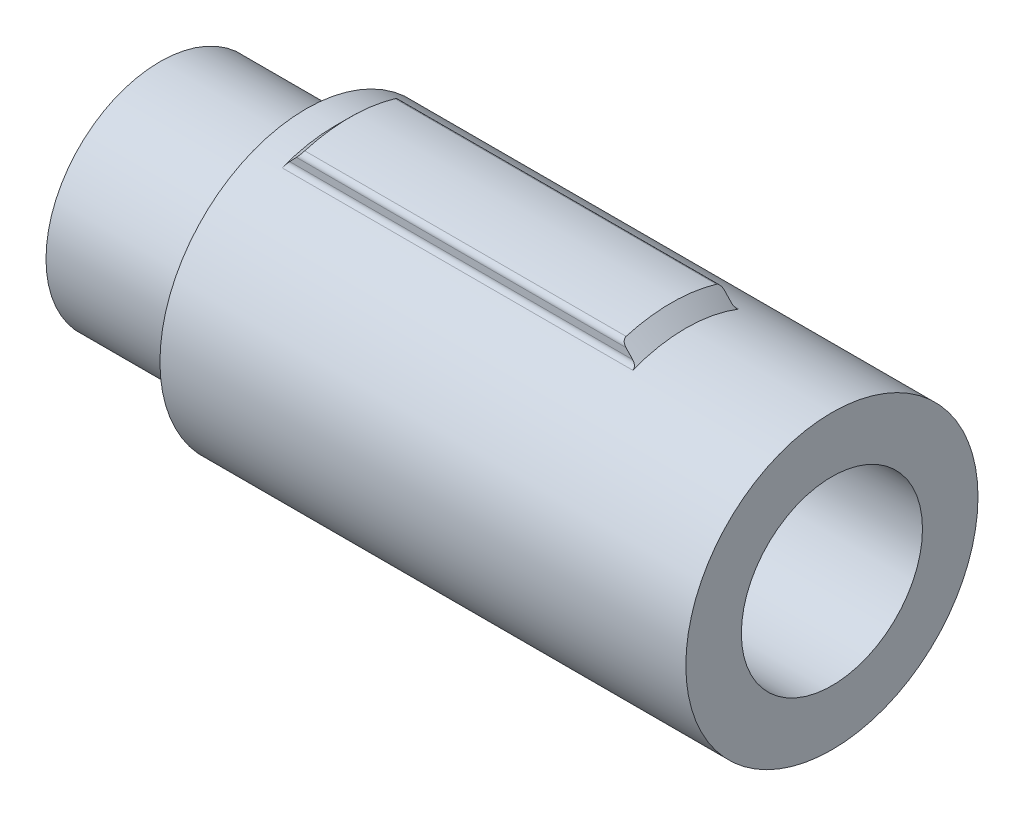
ISO-10303-21;
HEADER;
FILE_DESCRIPTION(('STEP AP214'),'2;1');
FILE_NAME('part.step','',(''),(''),'','','');
FILE_SCHEMA(('AUTOMOTIVE_DESIGN { 1 0 10303 214 1 1 1 1 }'));
ENDSEC;
DATA;
#1=APPLICATION_CONTEXT('core data for automotive mechanical design processes');
#2=APPLICATION_PROTOCOL_DEFINITION('international standard','automotive_design',2000,#1);
#3=PRODUCT_CONTEXT('',#1,'mechanical');
#4=PRODUCT('Part','Part','',(#3));
#5=PRODUCT_RELATED_PRODUCT_CATEGORY('part','',(#4));
#6=PRODUCT_DEFINITION_FORMATION('','',#4);
#7=PRODUCT_DEFINITION_CONTEXT('part definition',#1,'design');
#8=PRODUCT_DEFINITION('design','',#6,#7);
#9=PRODUCT_DEFINITION_SHAPE('','',#8);
#10=(LENGTH_UNIT() NAMED_UNIT(*) SI_UNIT(.MILLI.,.METRE.));
#11=(NAMED_UNIT(*) PLANE_ANGLE_UNIT() SI_UNIT($,.RADIAN.));
#12=(NAMED_UNIT(*) SI_UNIT($,.STERADIAN.) SOLID_ANGLE_UNIT());
#13=UNCERTAINTY_MEASURE_WITH_UNIT(LENGTH_MEASURE(1.E-05),#10,'distance_accuracy_value','');
#14=(GEOMETRIC_REPRESENTATION_CONTEXT(3) GLOBAL_UNCERTAINTY_ASSIGNED_CONTEXT((#13)) GLOBAL_UNIT_ASSIGNED_CONTEXT((#10,
#11,#12)) REPRESENTATION_CONTEXT('',''));
#15=CARTESIAN_POINT('',(0.,0.,0.));
#16=DIRECTION('',(0.,0.,1.));
#17=DIRECTION('',(1.,0.,0.));
#18=AXIS2_PLACEMENT_3D('',#15,#16,#17);
#19=CARTESIAN_POINT('',(0.,0.,0.));
#20=DIRECTION('',(-1.,0.,0.));
#21=DIRECTION('',(0.,0.,1.));
#22=AXIS2_PLACEMENT_3D('',#19,#20,#21);
#23=PLANE('',#22);
#24=CARTESIAN_POINT('',(0.,0.,0.));
#25=DIRECTION('',(-1.,0.,0.));
#26=DIRECTION('',(0.,0.,1.));
#27=AXIS2_PLACEMENT_3D('',#24,#25,#26);
#28=CIRCLE('',#27,2.6);
#29=CARTESIAN_POINT('',(0.,0.,2.6));
#30=VERTEX_POINT('',#29);
#31=EDGE_CURVE('E199',#30,#30,#28,.T.);
#32=ORIENTED_EDGE('',*,*,#31,.T.);
#33=EDGE_LOOP('',(#32));
#34=FACE_BOUND('',#33,.T.);
#35=DIRECTION('',(0.,0.,-1.));
#36=VECTOR('',#35,1.);
#37=CARTESIAN_POINT('',(0.,1.15,0.66395280956807));
#38=LINE('',#37,#36);
#39=CARTESIAN_POINT('',(0.,1.15,0.66395280956807));
#40=VERTEX_POINT('',#39);
#41=CARTESIAN_POINT('',(0.,1.15,-0.663952809568069));
#42=VERTEX_POINT('',#41);
#43=EDGE_CURVE('E742',#40,#42,#38,.T.);
#44=ORIENTED_EDGE('',*,*,#43,.F.);
#45=DIRECTION('',(0.,0.866025403784439,-0.5));
#46=VECTOR('',#45,1.);
#47=CARTESIAN_POINT('',(0.,0.,1.32790561913614));
#48=LINE('',#47,#46);
#49=CARTESIAN_POINT('',(0.,0.,1.32790561913614));
#50=VERTEX_POINT('',#49);
#51=EDGE_CURVE('E191',#50,#40,#48,.T.);
#52=ORIENTED_EDGE('',*,*,#51,.F.);
#53=DIRECTION('',(0.,0.866025403784438,0.5));
#54=VECTOR('',#53,1.);
#55=CARTESIAN_POINT('',(0.,-1.15,0.663952809568069));
#56=LINE('',#55,#54);
#57=CARTESIAN_POINT('',(0.,-1.15,0.663952809568069));
#58=VERTEX_POINT('',#57);
#59=EDGE_CURVE('E187',#58,#50,#56,.T.);
#60=ORIENTED_EDGE('',*,*,#59,.F.);
#61=DIRECTION('',(0.,0.,1.));
#62=VECTOR('',#61,1.);
#63=CARTESIAN_POINT('',(0.,-1.15,-0.66395280956807));
#64=LINE('',#63,#62);
#65=CARTESIAN_POINT('',(0.,-1.15,-0.66395280956807));
#66=VERTEX_POINT('',#65);
#67=EDGE_CURVE('E737',#66,#58,#64,.T.);
#68=ORIENTED_EDGE('',*,*,#67,.F.);
#69=DIRECTION('',(0.,-0.866025403784439,0.5));
#70=VECTOR('',#69,1.);
#71=CARTESIAN_POINT('',(0.,0.,-1.32790561913614));
#72=LINE('',#71,#70);
#73=CARTESIAN_POINT('',(0.,0.,-1.32790561913614));
#74=VERTEX_POINT('',#73);
#75=EDGE_CURVE('E753',#74,#66,#72,.T.);
#76=ORIENTED_EDGE('',*,*,#75,.F.);
#77=DIRECTION('',(0.,-0.866025403784438,-0.5));
#78=VECTOR('',#77,1.);
#79=CARTESIAN_POINT('',(0.,1.15,-0.663952809568069));
#80=LINE('',#79,#78);
#81=EDGE_CURVE('E746',#42,#74,#80,.T.);
#82=ORIENTED_EDGE('',*,*,#81,.F.);
#83=EDGE_LOOP('',(#44,#52,#60,#68,#76,#82));
#84=FACE_BOUND('',#83,.T.);
#85=ADVANCED_FACE('F47',(#34,#84),#23,.T.);
#86=CARTESIAN_POINT('',(0.999999999999997,0.,0.));
#87=DIRECTION('',(1.,0.,0.));
#88=DIRECTION('',(0.,0.,-1.));
#89=AXIS2_PLACEMENT_3D('',#86,#87,#88);
#90=CYLINDRICAL_SURFACE('',#89,3.1);
#91=CARTESIAN_POINT('',(18.,0.,0.));
#92=DIRECTION('',(1.,0.,0.));
#93=DIRECTION('',(0.,0.,-1.));
#94=AXIS2_PLACEMENT_3D('',#91,#92,#93);
#95=CIRCLE('',#94,3.1);
#96=CARTESIAN_POINT('',(18.,0.,-3.1));
#97=VERTEX_POINT('',#96);
#98=EDGE_CURVE('E236',#97,#97,#95,.T.);
#99=ORIENTED_EDGE('',*,*,#98,.T.);
#100=EDGE_LOOP('',(#99));
#101=FACE_BOUND('',#100,.T.);
#102=DIRECTION('',(-1.,0.,0.));
#103=VECTOR('',#102,1.);
#104=CARTESIAN_POINT('',(13.,2.6,1.68819430161341));
#105=LINE('',#104,#103);
#106=CARTESIAN_POINT('',(12.5,2.6,1.68819430161341));
#107=VERTEX_POINT('',#106);
#108=CARTESIAN_POINT('',(0.999999999999997,2.6,1.68819430161341));
#109=VERTEX_POINT('',#108);
#110=EDGE_CURVE('E225',#107,#109,#105,.T.);
#111=ORIENTED_EDGE('',*,*,#110,.F.);
#112=CARTESIAN_POINT('',(9.89999999999998,0.,0.));
#113=DIRECTION('',(0.707106781186545,-0.70710678118655,0.));
#114=DIRECTION('',(0.70710678118655,0.707106781186545,0.));
#115=AXIS2_PLACEMENT_3D('',#112,#113,#114);
#116=ELLIPSE('',#115,4.38406204335661,3.1);
#117=CARTESIAN_POINT('',(13.,3.1,0.));
#118=VERTEX_POINT('',#117);
#119=EDGE_CURVE('E11',#107,#118,#116,.F.);
#120=ORIENTED_EDGE('',*,*,#119,.T.);
#121=CARTESIAN_POINT('',(9.89999999999998,0.,0.));
#122=DIRECTION('',(0.707106781186545,-0.70710678118655,0.));
#123=DIRECTION('',(0.70710678118655,0.707106781186545,0.));
#124=AXIS2_PLACEMENT_3D('',#121,#122,#123);
#125=ELLIPSE('',#124,4.38406204335661,3.1);
#126=CARTESIAN_POINT('',(12.5,2.6,-1.68819430161341));
#127=VERTEX_POINT('',#126);
#128=EDGE_CURVE('E58',#118,#127,#125,.F.);
#129=ORIENTED_EDGE('',*,*,#128,.T.);
#130=DIRECTION('',(-1.,0.,0.));
#131=VECTOR('',#130,1.);
#132=CARTESIAN_POINT('',(13.,2.6,-1.68819430161341));
#133=LINE('',#132,#131);
#134=CARTESIAN_POINT('',(0.999999999999997,2.6,-1.68819430161341));
#135=VERTEX_POINT('',#134);
#136=EDGE_CURVE('E222',#127,#135,#133,.T.);
#137=ORIENTED_EDGE('',*,*,#136,.T.);
#138=CARTESIAN_POINT('',(0.999999999999997,0.,0.));
#139=DIRECTION('',(1.,0.,0.));
#140=DIRECTION('',(0.,0.,-1.));
#141=AXIS2_PLACEMENT_3D('',#138,#139,#140);
#142=CIRCLE('',#141,3.1);
#143=EDGE_CURVE('E237',#109,#135,#142,.T.);
#144=ORIENTED_EDGE('',*,*,#143,.F.);
#145=EDGE_LOOP('',(#111,#120,#129,#137,#144));
#146=FACE_BOUND('',#145,.T.);
#147=ADVANCED_FACE('F463',(#101,#146),#90,.F.);
#148=CARTESIAN_POINT('',(0.999999999999997,0.,0.));
#149=DIRECTION('',(1.,0.,0.));
#150=DIRECTION('',(0.,0.,-1.));
#151=AXIS2_PLACEMENT_3D('',#148,#149,#150);
#152=PLANE('',#151);
#153=ORIENTED_EDGE('',*,*,#143,.T.);
#154=DIRECTION('',(0.,0.,-1.));
#155=VECTOR('',#154,1.);
#156=CARTESIAN_POINT('',(0.999999999999997,2.6,1.68819430161341));
#157=LINE('',#156,#155);
#158=EDGE_CURVE('E212',#109,#135,#157,.T.);
#159=ORIENTED_EDGE('',*,*,#158,.F.);
#160=EDGE_LOOP('',(#153,#159));
#161=FACE_BOUND('',#160,.T.);
#162=ADVANCED_FACE('F394',(#161),#152,.T.);
#163=CARTESIAN_POINT('',(18.,0.,0.));
#164=DIRECTION('',(-1.,0.,0.));
#165=DIRECTION('',(0.,0.,1.));
#166=AXIS2_PLACEMENT_3D('',#163,#164,#165);
#167=CYLINDRICAL_SURFACE('',#166,5.);
#168=CARTESIAN_POINT('',(0.999999999999997,0.,0.));
#169=DIRECTION('',(1.,0.,0.));
#170=DIRECTION('',(0.,0.,-1.));
#171=AXIS2_PLACEMENT_3D('',#168,#169,#170);
#172=CIRCLE('',#171,5.);
#173=CARTESIAN_POINT('',(0.999999999999997,4.65872303665324,-1.81557144385905));
#174=VERTEX_POINT('',#173);
#175=CARTESIAN_POINT('',(0.999999999999997,4.65872303665324,1.81557144385905));
#176=VERTEX_POINT('',#175);
#177=EDGE_CURVE('E228',#174,#176,#172,.T.);
#178=ORIENTED_EDGE('',*,*,#177,.F.);
#179=DIRECTION('',(-1.,0.,0.));
#180=VECTOR('',#179,1.);
#181=CARTESIAN_POINT('',(18.,4.65872303665324,-1.81557144385905));
#182=LINE('',#181,#180);
#183=CARTESIAN_POINT('',(13.,4.65872303665324,-1.81557144385905));
#184=VERTEX_POINT('',#183);
#185=EDGE_CURVE('E261',#174,#184,#182,.F.);
#186=ORIENTED_EDGE('',*,*,#185,.T.);
#187=CARTESIAN_POINT('',(13.,0.,0.));
#188=DIRECTION('',(1.,0.,0.));
#189=DIRECTION('',(0.,0.,-1.));
#190=AXIS2_PLACEMENT_3D('',#187,#188,#189);
#191=CIRCLE('',#190,5.);
#192=CARTESIAN_POINT('',(13.,4.65872303665324,1.81557144385905));
#193=VERTEX_POINT('',#192);
#194=EDGE_CURVE('E232',#184,#193,#191,.T.);
#195=ORIENTED_EDGE('',*,*,#194,.T.);
#196=DIRECTION('',(-1.,0.,0.));
#197=VECTOR('',#196,1.);
#198=CARTESIAN_POINT('',(18.,4.65872303665324,1.81557144385905));
#199=LINE('',#198,#197);
#200=EDGE_CURVE('E257',#193,#176,#199,.T.);
#201=ORIENTED_EDGE('',*,*,#200,.T.);
#202=EDGE_LOOP('',(#178,#186,#195,#201));
#203=FACE_BOUND('',#202,.T.);
#204=CARTESIAN_POINT('',(18.,0.,0.));
#205=DIRECTION('',(1.,0.,0.));
#206=DIRECTION('',(0.,0.,-1.));
#207=AXIS2_PLACEMENT_3D('',#204,#205,#206);
#208=CIRCLE('',#207,5.);
#209=CARTESIAN_POINT('',(18.,0.,-5.));
#210=VERTEX_POINT('',#209);
#211=EDGE_CURVE('E218',#210,#210,#208,.T.);
#212=ORIENTED_EDGE('',*,*,#211,.F.);
#213=EDGE_LOOP('',(#212));
#214=FACE_BOUND('',#213,.T.);
#215=CARTESIAN_POINT('',(0.,0.,0.));
#216=DIRECTION('',(1.,0.,0.));
#217=DIRECTION('',(0.,0.,-1.));
#218=AXIS2_PLACEMENT_3D('',#215,#216,#217);
#219=CIRCLE('',#218,5.);
#220=CARTESIAN_POINT('',(0.,0.,-5.));
#221=VERTEX_POINT('',#220);
#222=EDGE_CURVE('E241',#221,#221,#219,.T.);
#223=ORIENTED_EDGE('',*,*,#222,.T.);
#224=EDGE_LOOP('',(#223));
#225=FACE_BOUND('',#224,.T.);
#226=ADVANCED_FACE('F448',(#203,#214,#225),#167,.T.);
#227=CARTESIAN_POINT('',(18.,0.,0.));
#228=DIRECTION('',(1.,0.,0.));
#229=DIRECTION('',(0.,0.,-1.));
#230=AXIS2_PLACEMENT_3D('',#227,#228,#229);
#231=PLANE('',#230);
#232=ORIENTED_EDGE('',*,*,#98,.F.);
#233=EDGE_LOOP('',(#232));
#234=FACE_BOUND('',#233,.T.);
#235=ORIENTED_EDGE('',*,*,#211,.T.);
#236=EDGE_LOOP('',(#235));
#237=FACE_BOUND('',#236,.T.);
#238=ADVANCED_FACE('F456',(#234,#237),#231,.T.);
#239=CARTESIAN_POINT('',(0.,0.,0.));
#240=DIRECTION('',(1.,0.,0.));
#241=DIRECTION('',(0.,0.,-1.));
#242=AXIS2_PLACEMENT_3D('',#239,#240,#241);
#243=PLANE('',#242);
#244=CARTESIAN_POINT('',(0.,0.,0.));
#245=DIRECTION('',(-1.,0.,0.));
#246=DIRECTION('',(0.,0.,1.));
#247=AXIS2_PLACEMENT_3D('',#244,#245,#246);
#248=CIRCLE('',#247,3.9);
#249=CARTESIAN_POINT('',(0.,0.,3.9));
#250=VERTEX_POINT('',#249);
#251=EDGE_CURVE('E213',#250,#250,#248,.T.);
#252=ORIENTED_EDGE('',*,*,#251,.F.);
#253=EDGE_LOOP('',(#252));
#254=FACE_BOUND('',#253,.T.);
#255=ORIENTED_EDGE('',*,*,#222,.F.);
#256=EDGE_LOOP('',(#255));
#257=FACE_BOUND('',#256,.T.);
#258=ADVANCED_FACE('F388',(#254,#257),#243,.F.);
#259=CARTESIAN_POINT('',(13.,2.6,1.68819430161341));
#260=DIRECTION('',(0.,1.,0.));
#261=DIRECTION('',(0.,0.,1.));
#262=AXIS2_PLACEMENT_3D('',#259,#260,#261);
#263=PLANE('',#262);
#264=ORIENTED_EDGE('',*,*,#136,.F.);
#265=DIRECTION('',(0.,0.,1.));
#266=VECTOR('',#265,1.);
#267=CARTESIAN_POINT('',(12.5,2.6,1.68819430161341));
#268=LINE('',#267,#266);
#269=EDGE_CURVE('E281',#127,#107,#268,.T.);
#270=ORIENTED_EDGE('',*,*,#269,.T.);
#271=ORIENTED_EDGE('',*,*,#110,.T.);
#272=ORIENTED_EDGE('',*,*,#158,.T.);
#273=EDGE_LOOP('',(#264,#270,#271,#272));
#274=FACE_BOUND('',#273,.T.);
#275=ADVANCED_FACE('F385',(#274),#263,.F.);
#276=CARTESIAN_POINT('',(13.,2.6,1.68819430161341));
#277=DIRECTION('',(0.,0.,-1.));
#278=DIRECTION('',(0.,1.,0.));
#279=AXIS2_PLACEMENT_3D('',#276,#277,#278);
#280=PLANE('',#279);
#281=DIRECTION('',(-1.,0.,0.));
#282=VECTOR('',#281,1.);
#283=CARTESIAN_POINT('',(13.,5.08677478572085,1.68819430161341));
#284=LINE('',#283,#282);
#285=CARTESIAN_POINT('',(12.6404032128671,5.08677478572085,1.68819430161341));
#286=VERTEX_POINT('',#285);
#287=CARTESIAN_POINT('',(1.35959678713291,5.08677478572085,1.68819430161341));
#288=VERTEX_POINT('',#287);
#289=EDGE_CURVE('E273',#286,#288,#284,.T.);
#290=ORIENTED_EDGE('',*,*,#289,.T.);
#291=CARTESIAN_POINT('',(1.35959678713291,5.08677478572085,1.68819430161341));
#292=CARTESIAN_POINT('',(1.32140698524297,5.04653900977732,1.68819430161341));
#293=CARTESIAN_POINT('',(1.28324254793083,5.00627921967984,1.68819430161341));
#294=CARTESIAN_POINT('',(1.20696440180245,4.92571161048018,1.68819430161341));
#295=CARTESIAN_POINT('',(1.16885069298709,4.88540379137717,1.68819430161341));
#296=CARTESIAN_POINT('',(1.13076234875039,4.84507195811937,1.68819430161341));
#297=B_SPLINE_CURVE_WITH_KNOTS('',3,(#291,#292,#293,#294,#295,#296),.UNSPECIFIED.,.F.,.F.,(4,2,
4),(0.,0.166422278455772,0.332844559790126),.UNSPECIFIED.);
#298=CARTESIAN_POINT('',(1.13076234875039,4.84507195811937,1.68819430161341));
#299=VERTEX_POINT('',#298);
#300=EDGE_CURVE('E335',#288,#299,#297,.T.);
#301=ORIENTED_EDGE('',*,*,#300,.T.);
#302=DIRECTION('',(1.,0.,0.));
#303=VECTOR('',#302,1.);
#304=CARTESIAN_POINT('',(13.,4.84507195811937,1.68819430161341));
#305=LINE('',#304,#303);
#306=CARTESIAN_POINT('',(12.8692376512496,4.84507195811937,1.68819430161341));
#307=VERTEX_POINT('',#306);
#308=EDGE_CURVE('E277',#299,#307,#305,.T.);
#309=ORIENTED_EDGE('',*,*,#308,.T.);
#310=CARTESIAN_POINT('',(12.8692376512496,4.84507195811937,1.68819430161341));
#311=CARTESIAN_POINT('',(12.8311493070129,4.88540379137717,1.68819430161341));
#312=CARTESIAN_POINT('',(12.7930355981975,4.92571161048018,1.68819430161341));
#313=CARTESIAN_POINT('',(12.7167574520692,5.00627921967984,1.68819430161341));
#314=CARTESIAN_POINT('',(12.678593014757,5.04653900977732,1.68819430161341));
#315=CARTESIAN_POINT('',(12.6404032128671,5.08677478572085,1.68819430161341));
#316=B_SPLINE_CURVE_WITH_KNOTS('',3,(#310,#311,#312,#313,#314,#315),.UNSPECIFIED.,.F.,.F.,(4,2,
4),(0.,0.166422281334353,0.332844559790127),.UNSPECIFIED.);
#317=EDGE_CURVE('E397',#307,#286,#316,.T.);
#318=ORIENTED_EDGE('',*,*,#317,.T.);
#319=EDGE_LOOP('',(#290,#301,#309,#318));
#320=FACE_BOUND('',#319,.T.);
#321=ADVANCED_FACE('F382',(#320),#280,.F.);
#322=CARTESIAN_POINT('',(13.,2.6,-1.68819430161341));
#323=DIRECTION('',(0.,0.,1.));
#324=DIRECTION('',(0.,-1.,0.));
#325=AXIS2_PLACEMENT_3D('',#322,#323,#324);
#326=PLANE('',#325);
#327=DIRECTION('',(1.,0.,0.));
#328=VECTOR('',#327,1.);
#329=CARTESIAN_POINT('',(0.999999999999997,4.84507195811937,-1.68819430161341));
#330=LINE('',#329,#328);
#331=CARTESIAN_POINT('',(12.8692376512496,4.84507195811937,-1.68819430161341));
#332=VERTEX_POINT('',#331);
#333=CARTESIAN_POINT('',(1.13076234875039,4.84507195811937,-1.68819430161341));
#334=VERTEX_POINT('',#333);
#335=EDGE_CURVE('E253',#332,#334,#330,.F.);
#336=ORIENTED_EDGE('',*,*,#335,.T.);
#337=CARTESIAN_POINT('',(1.13076234875039,4.84507195811937,-1.68819430161341));
#338=CARTESIAN_POINT('',(1.16885069298709,4.88540379137717,-1.68819430161341));
#339=CARTESIAN_POINT('',(1.20696440180245,4.92571161048018,-1.68819430161341));
#340=CARTESIAN_POINT('',(1.28324254793083,5.00627921967984,-1.68819430161341));
#341=CARTESIAN_POINT('',(1.32140698524297,5.04653900977732,-1.68819430161341));
#342=CARTESIAN_POINT('',(1.35959678713291,5.08677478572085,-1.68819430161341));
#343=B_SPLINE_CURVE_WITH_KNOTS('',3,(#337,#338,#339,#340,#341,#342),.UNSPECIFIED.,.F.,.F.,(4,2,
4),(0.,0.166422281334354,0.332844559790126),.UNSPECIFIED.);
#344=CARTESIAN_POINT('',(1.35959678713291,5.08677478572085,-1.68819430161341));
#345=VERTEX_POINT('',#344);
#346=EDGE_CURVE('E359',#334,#345,#343,.T.);
#347=ORIENTED_EDGE('',*,*,#346,.T.);
#348=DIRECTION('',(-1.,0.,0.));
#349=VECTOR('',#348,1.);
#350=CARTESIAN_POINT('',(13.,5.08677478572085,-1.68819430161341));
#351=LINE('',#350,#349);
#352=CARTESIAN_POINT('',(12.6404032128671,5.08677478572085,-1.68819430161341));
#353=VERTEX_POINT('',#352);
#354=EDGE_CURVE('E217',#345,#353,#351,.F.);
#355=ORIENTED_EDGE('',*,*,#354,.T.);
#356=CARTESIAN_POINT('',(12.6404032128671,5.08677478572085,-1.68819430161341));
#357=CARTESIAN_POINT('',(12.678593014757,5.04653900977732,-1.68819430161341));
#358=CARTESIAN_POINT('',(12.7167574520692,5.00627921967984,-1.68819430161341));
#359=CARTESIAN_POINT('',(12.7930355981975,4.92571161048018,-1.68819430161341));
#360=CARTESIAN_POINT('',(12.8311493070129,4.88540379137717,-1.68819430161341));
#361=CARTESIAN_POINT('',(12.8692376512496,4.84507195811937,-1.68819430161341));
#362=B_SPLINE_CURVE_WITH_KNOTS('',3,(#356,#357,#358,#359,#360,#361),.UNSPECIFIED.,.F.,.F.,(4,2,
4),(0.,0.166422278455774,0.332844559790128),.UNSPECIFIED.);
#363=EDGE_CURVE('E367',#353,#332,#362,.T.);
#364=ORIENTED_EDGE('',*,*,#363,.T.);
#365=EDGE_LOOP('',(#336,#347,#355,#364));
#366=FACE_BOUND('',#365,.T.);
#367=ADVANCED_FACE('F376',(#366),#326,.F.);
#368=CARTESIAN_POINT('',(13.,0.,0.));
#369=DIRECTION('',(-1.,0.,0.));
#370=DIRECTION('',(0.,0.,1.));
#371=AXIS2_PLACEMENT_3D('',#368,#369,#370);
#372=CYLINDRICAL_SURFACE('',#371,5.5);
#373=DIRECTION('',(-1.,0.,0.));
#374=VECTOR('',#373,1.);
#375=CARTESIAN_POINT('',(13.,5.27872855121975,-1.544352577146));
#376=LINE('',#375,#374);
#377=CARTESIAN_POINT('',(12.5,5.27872855121975,-1.544352577146));
#378=VERTEX_POINT('',#377);
#379=CARTESIAN_POINT('',(1.5,5.27872855121975,-1.544352577146));
#380=VERTEX_POINT('',#379);
#381=EDGE_CURVE('E269',#378,#380,#376,.T.);
#382=ORIENTED_EDGE('',*,*,#381,.T.);
#383=CARTESIAN_POINT('',(1.5,0.,0.));
#384=DIRECTION('',(1.,0.,0.));
#385=DIRECTION('',(0.,0.,-1.));
#386=AXIS2_PLACEMENT_3D('',#383,#384,#385);
#387=CIRCLE('',#386,5.5);
#388=CARTESIAN_POINT('',(1.5,5.27872855121975,1.544352577146));
#389=VERTEX_POINT('',#388);
#390=EDGE_CURVE('E288',#380,#389,#387,.T.);
#391=ORIENTED_EDGE('',*,*,#390,.T.);
#392=DIRECTION('',(-1.,0.,0.));
#393=VECTOR('',#392,1.);
#394=CARTESIAN_POINT('',(13.,5.27872855121975,1.544352577146));
#395=LINE('',#394,#393);
#396=CARTESIAN_POINT('',(12.5,5.27872855121975,1.544352577146));
#397=VERTEX_POINT('',#396);
#398=EDGE_CURVE('E265',#389,#397,#395,.F.);
#399=ORIENTED_EDGE('',*,*,#398,.T.);
#400=CARTESIAN_POINT('',(12.5,0.,0.));
#401=DIRECTION('',(1.,0.,0.));
#402=DIRECTION('',(0.,0.,-1.));
#403=AXIS2_PLACEMENT_3D('',#400,#401,#402);
#404=CIRCLE('',#403,5.5);
#405=EDGE_CURVE('E285',#397,#378,#404,.F.);
#406=ORIENTED_EDGE('',*,*,#405,.T.);
#407=EDGE_LOOP('',(#382,#391,#399,#406));
#408=FACE_BOUND('',#407,.T.);
#409=ADVANCED_FACE('F381',(#408),#372,.T.);
#410=CARTESIAN_POINT('',(-5.,0.,0.));
#411=DIRECTION('',(1.,0.,0.));
#412=DIRECTION('',(0.,0.,-1.));
#413=AXIS2_PLACEMENT_3D('',#410,#411,#412);
#414=CYLINDRICAL_SURFACE('',#413,3.9);
#415=CARTESIAN_POINT('',(-5.,0.,0.));
#416=DIRECTION('',(-1.,0.,0.));
#417=DIRECTION('',(0.,0.,1.));
#418=AXIS2_PLACEMENT_3D('',#415,#416,#417);
#419=CIRCLE('',#418,3.9);
#420=CARTESIAN_POINT('',(-5.,0.,3.9));
#421=VERTEX_POINT('',#420);
#422=EDGE_CURVE('E207',#421,#421,#419,.T.);
#423=ORIENTED_EDGE('',*,*,#422,.F.);
#424=EDGE_LOOP('',(#423));
#425=FACE_BOUND('',#424,.T.);
#426=ORIENTED_EDGE('',*,*,#251,.T.);
#427=EDGE_LOOP('',(#426));
#428=FACE_BOUND('',#427,.T.);
#429=ADVANCED_FACE('F496',(#425,#428),#414,.T.);
#430=CARTESIAN_POINT('',(-5.,0.,0.));
#431=DIRECTION('',(-1.,0.,0.));
#432=DIRECTION('',(0.,0.,1.));
#433=AXIS2_PLACEMENT_3D('',#430,#431,#432);
#434=PLANE('',#433);
#435=CARTESIAN_POINT('',(-5.,0.,0.));
#436=DIRECTION('',(-1.,0.,0.));
#437=DIRECTION('',(0.,0.,1.));
#438=AXIS2_PLACEMENT_3D('',#435,#436,#437);
#439=CIRCLE('',#438,2.6);
#440=CARTESIAN_POINT('',(-5.,0.,2.6));
#441=VERTEX_POINT('',#440);
#442=EDGE_CURVE('E194',#441,#441,#439,.T.);
#443=ORIENTED_EDGE('',*,*,#442,.F.);
#444=EDGE_LOOP('',(#443));
#445=FACE_BOUND('',#444,.T.);
#446=ORIENTED_EDGE('',*,*,#422,.T.);
#447=EDGE_LOOP('',(#446));
#448=FACE_BOUND('',#447,.T.);
#449=ADVANCED_FACE('F493',(#445,#448),#434,.T.);
#450=CARTESIAN_POINT('',(0.,0.,0.));
#451=DIRECTION('',(-1.,0.,0.));
#452=DIRECTION('',(0.,0.,1.));
#453=AXIS2_PLACEMENT_3D('',#450,#451,#452);
#454=CYLINDRICAL_SURFACE('',#453,2.6);
#455=ORIENTED_EDGE('',*,*,#31,.F.);
#456=EDGE_LOOP('',(#455));
#457=FACE_BOUND('',#456,.T.);
#458=ORIENTED_EDGE('',*,*,#442,.T.);
#459=EDGE_LOOP('',(#458));
#460=FACE_BOUND('',#459,.T.);
#461=ADVANCED_FACE('F490',(#457,#460),#454,.F.);
#462=CARTESIAN_POINT('',(-3.,0.,1.32790561913614));
#463=DIRECTION('',(0.,-0.5,-0.866025403784439));
#464=DIRECTION('',(0.,0.866025403784439,-0.5));
#465=AXIS2_PLACEMENT_3D('',#462,#463,#464);
#466=PLANE('',#465);
#467=ORIENTED_EDGE('',*,*,#51,.T.);
#468=DIRECTION('',(1.,0.,0.));
#469=VECTOR('',#468,1.);
#470=CARTESIAN_POINT('',(-3.,1.15,0.66395280956807));
#471=LINE('',#470,#469);
#472=CARTESIAN_POINT('',(-3.,1.15,0.66395280956807));
#473=VERTEX_POINT('',#472);
#474=EDGE_CURVE('E169',#473,#40,#471,.T.);
#475=ORIENTED_EDGE('',*,*,#474,.F.);
#476=DIRECTION('',(0.,0.866025403784439,-0.5));
#477=VECTOR('',#476,1.);
#478=CARTESIAN_POINT('',(-3.,0.,1.32790561913614));
#479=LINE('',#478,#477);
#480=CARTESIAN_POINT('',(-3.,0.,1.32790561913614));
#481=VERTEX_POINT('',#480);
#482=EDGE_CURVE('E177',#481,#473,#479,.T.);
#483=ORIENTED_EDGE('',*,*,#482,.F.);
#484=DIRECTION('',(1.,0.,0.));
#485=VECTOR('',#484,1.);
#486=CARTESIAN_POINT('',(-3.,0.,1.32790561913614));
#487=LINE('',#486,#485);
#488=EDGE_CURVE('E731',#481,#50,#487,.T.);
#489=ORIENTED_EDGE('',*,*,#488,.T.);
#490=EDGE_LOOP('',(#467,#475,#483,#489));
#491=FACE_BOUND('',#490,.T.);
#492=ADVANCED_FACE('F189',(#491),#466,.F.);
#493=CARTESIAN_POINT('',(-3.,1.15,0.66395280956807));
#494=DIRECTION('',(0.,-1.,0.));
#495=DIRECTION('',(0.,0.,-1.));
#496=AXIS2_PLACEMENT_3D('',#493,#494,#495);
#497=PLANE('',#496);
#498=ORIENTED_EDGE('',*,*,#43,.T.);
#499=DIRECTION('',(1.,0.,0.));
#500=VECTOR('',#499,1.);
#501=CARTESIAN_POINT('',(-3.,1.15,-0.663952809568069));
#502=LINE('',#501,#500);
#503=CARTESIAN_POINT('',(-3.,1.15,-0.663952809568069));
#504=VERTEX_POINT('',#503);
#505=EDGE_CURVE('E172',#504,#42,#502,.T.);
#506=ORIENTED_EDGE('',*,*,#505,.F.);
#507=DIRECTION('',(0.,0.,-1.));
#508=VECTOR('',#507,1.);
#509=CARTESIAN_POINT('',(-3.,1.15,0.66395280956807));
#510=LINE('',#509,#508);
#511=EDGE_CURVE('E165',#473,#504,#510,.T.);
#512=ORIENTED_EDGE('',*,*,#511,.F.);
#513=ORIENTED_EDGE('',*,*,#474,.T.);
#514=EDGE_LOOP('',(#498,#506,#512,#513));
#515=FACE_BOUND('',#514,.T.);
#516=ADVANCED_FACE('F167',(#515),#497,.F.);
#517=CARTESIAN_POINT('',(-3.,1.15,-0.663952809568069));
#518=DIRECTION('',(0.,-0.5,0.866025403784439));
#519=DIRECTION('',(0.,-0.866025403784439,-0.5));
#520=AXIS2_PLACEMENT_3D('',#517,#518,#519);
#521=PLANE('',#520);
#522=ORIENTED_EDGE('',*,*,#81,.T.);
#523=DIRECTION('',(1.,0.,0.));
#524=VECTOR('',#523,1.);
#525=CARTESIAN_POINT('',(-3.,0.,-1.32790561913614));
#526=LINE('',#525,#524);
#527=CARTESIAN_POINT('',(-3.,0.,-1.32790561913614));
#528=VERTEX_POINT('',#527);
#529=EDGE_CURVE('E201',#528,#74,#526,.T.);
#530=ORIENTED_EDGE('',*,*,#529,.F.);
#531=DIRECTION('',(0.,-0.866025403784438,-0.5));
#532=VECTOR('',#531,1.);
#533=CARTESIAN_POINT('',(-3.,1.15,-0.663952809568069));
#534=LINE('',#533,#532);
#535=EDGE_CURVE('E176',#504,#528,#534,.T.);
#536=ORIENTED_EDGE('',*,*,#535,.F.);
#537=ORIENTED_EDGE('',*,*,#505,.T.);
#538=EDGE_LOOP('',(#522,#530,#536,#537));
#539=FACE_BOUND('',#538,.T.);
#540=ADVANCED_FACE('F605',(#539),#521,.F.);
#541=CARTESIAN_POINT('',(-3.,0.,-1.32790561913614));
#542=DIRECTION('',(0.,0.5,0.866025403784439));
#543=DIRECTION('',(0.,-0.866025403784439,0.5));
#544=AXIS2_PLACEMENT_3D('',#541,#542,#543);
#545=PLANE('',#544);
#546=ORIENTED_EDGE('',*,*,#75,.T.);
#547=DIRECTION('',(1.,0.,0.));
#548=VECTOR('',#547,1.);
#549=CARTESIAN_POINT('',(-3.,-1.15,-0.66395280956807));
#550=LINE('',#549,#548);
#551=CARTESIAN_POINT('',(-3.,-1.15,-0.66395280956807));
#552=VERTEX_POINT('',#551);
#553=EDGE_CURVE('E760',#552,#66,#550,.T.);
#554=ORIENTED_EDGE('',*,*,#553,.F.);
#555=DIRECTION('',(0.,-0.866025403784439,0.5));
#556=VECTOR('',#555,1.);
#557=CARTESIAN_POINT('',(-3.,0.,-1.32790561913614));
#558=LINE('',#557,#556);
#559=EDGE_CURVE('E769',#528,#552,#558,.T.);
#560=ORIENTED_EDGE('',*,*,#559,.F.);
#561=ORIENTED_EDGE('',*,*,#529,.T.);
#562=EDGE_LOOP('',(#546,#554,#560,#561));
#563=FACE_BOUND('',#562,.T.);
#564=ADVANCED_FACE('F613',(#563),#545,.F.);
#565=CARTESIAN_POINT('',(-3.,-1.15,-0.66395280956807));
#566=DIRECTION('',(0.,1.,0.));
#567=DIRECTION('',(0.,0.,1.));
#568=AXIS2_PLACEMENT_3D('',#565,#566,#567);
#569=PLANE('',#568);
#570=ORIENTED_EDGE('',*,*,#67,.T.);
#571=DIRECTION('',(1.,0.,0.));
#572=VECTOR('',#571,1.);
#573=CARTESIAN_POINT('',(-3.,-1.15,0.663952809568069));
#574=LINE('',#573,#572);
#575=CARTESIAN_POINT('',(-3.,-1.15,0.663952809568069));
#576=VERTEX_POINT('',#575);
#577=EDGE_CURVE('E733',#576,#58,#574,.T.);
#578=ORIENTED_EDGE('',*,*,#577,.F.);
#579=DIRECTION('',(0.,0.,1.));
#580=VECTOR('',#579,1.);
#581=CARTESIAN_POINT('',(-3.,-1.15,-0.66395280956807));
#582=LINE('',#581,#580);
#583=EDGE_CURVE('E771',#552,#576,#582,.T.);
#584=ORIENTED_EDGE('',*,*,#583,.F.);
#585=ORIENTED_EDGE('',*,*,#553,.T.);
#586=EDGE_LOOP('',(#570,#578,#584,#585));
#587=FACE_BOUND('',#586,.T.);
#588=ADVANCED_FACE('F623',(#587),#569,.F.);
#589=CARTESIAN_POINT('',(-3.,-1.15,0.663952809568069));
#590=DIRECTION('',(0.,0.5,-0.866025403784438));
#591=DIRECTION('',(0.,0.866025403784438,0.5));
#592=AXIS2_PLACEMENT_3D('',#589,#590,#591);
#593=PLANE('',#592);
#594=ORIENTED_EDGE('',*,*,#59,.T.);
#595=ORIENTED_EDGE('',*,*,#488,.F.);
#596=DIRECTION('',(0.,0.866025403784438,0.5));
#597=VECTOR('',#596,1.);
#598=CARTESIAN_POINT('',(-3.,-1.15,0.663952809568069));
#599=LINE('',#598,#597);
#600=EDGE_CURVE('E182',#576,#481,#599,.T.);
#601=ORIENTED_EDGE('',*,*,#600,.F.);
#602=ORIENTED_EDGE('',*,*,#577,.T.);
#603=EDGE_LOOP('',(#594,#595,#601,#602));
#604=FACE_BOUND('',#603,.T.);
#605=ADVANCED_FACE('F633',(#604),#593,.F.);
#606=CARTESIAN_POINT('',(-3.,0.,0.));
#607=DIRECTION('',(-1.,0.,0.));
#608=DIRECTION('',(0.,0.,1.));
#609=AXIS2_PLACEMENT_3D('',#606,#607,#608);
#610=PLANE('',#609);
#611=ORIENTED_EDGE('',*,*,#482,.T.);
#612=ORIENTED_EDGE('',*,*,#511,.T.);
#613=ORIENTED_EDGE('',*,*,#535,.T.);
#614=ORIENTED_EDGE('',*,*,#559,.T.);
#615=ORIENTED_EDGE('',*,*,#583,.T.);
#616=ORIENTED_EDGE('',*,*,#600,.T.);
#617=EDGE_LOOP('',(#611,#612,#613,#614,#615,#616));
#618=FACE_BOUND('',#617,.T.);
#619=ADVANCED_FACE('F180',(#618),#610,.T.);
#620=CARTESIAN_POINT('',(18.,4.84507195811937,-1.88819430161341));
#621=DIRECTION('',(-1.,0.,0.));
#622=DIRECTION('',(0.,0.,1.));
#623=AXIS2_PLACEMENT_3D('',#620,#621,#622);
#624=CYLINDRICAL_SURFACE('',#623,0.2);
#625=ORIENTED_EDGE('',*,*,#185,.F.);
#626=CARTESIAN_POINT('',(0.999999999999997,4.65872303665323,-1.81557144385905));
#627=CARTESIAN_POINT('',(0.999983748111212,4.6619382632569,-1.80727920218919));
#628=CARTESIAN_POINT('',(1.00061585457041,4.66572476298732,-1.79923590984665));
#629=CARTESIAN_POINT('',(1.00303422894234,4.67419246686593,-1.78391370856185));
#630=CARTESIAN_POINT('',(1.00481006189588,4.6788653150199,-1.77662857363976));
#631=CARTESIAN_POINT('',(1.00937131147519,4.68890891707017,-1.76295254708668));
#632=CARTESIAN_POINT('',(1.01215382726708,4.6942776375164,-1.75655915842991));
#633=CARTESIAN_POINT('',(1.0185495927835,4.7055231346406,-1.74469155335733));
#634=CARTESIAN_POINT('',(1.02216440764391,4.71140085533343,-1.73921910275218));
#635=CARTESIAN_POINT('',(1.03174961465827,4.7260887146423,-1.72704496190922));
#636=CARTESIAN_POINT('',(1.0380646607951,4.73507338301953,-1.72082593107575));
#637=CARTESIAN_POINT('',(1.05165333224096,4.75339170324305,-1.71012721548409));
#638=CARTESIAN_POINT('',(1.05893129056561,4.7627267871798,-1.70565577746465));
#639=CARTESIAN_POINT('',(1.07648786576985,4.78439617314964,-1.69716213931575));
#640=CARTESIAN_POINT('',(1.08699702622578,4.79676267242002,-1.6937094380035));
#641=CARTESIAN_POINT('',(1.10855411886996,4.82118179463705,-1.68924896636091));
#642=CARTESIAN_POINT('',(1.11959299420784,4.83323640401641,-1.68820919659676));
#643=CARTESIAN_POINT('',(1.13076234875039,4.84507195811937,-1.68819430161341));
#644=B_SPLINE_CURVE_WITH_KNOTS('',3,(#626,#627,#628,#629,#630,#631,#632,#633,#634,#635,#636,
#637,#638,#639,#640,#641,#642,#643),.UNSPECIFIED.,.F.,.F.,(4,2,2,2,2,2,2,2,4),(0.,
0.0265992552093416,0.0529592014359875,0.0792437866775624,0.105578209638784,0.143231709618117,
0.181060807645761,0.230623146777781,0.279524356281565),.UNSPECIFIED.);
#645=EDGE_CURVE('E351',#174,#334,#644,.T.);
#646=ORIENTED_EDGE('',*,*,#645,.T.);
#647=ORIENTED_EDGE('',*,*,#335,.F.);
#648=CARTESIAN_POINT('',(12.8692376512496,4.84507195811937,-1.68819430161341));
#649=CARTESIAN_POINT('',(12.8807513591881,4.83287090600486,-1.68821063380641));
#650=CARTESIAN_POINT('',(12.892132503687,4.82043113536866,-1.68931559595254));
#651=CARTESIAN_POINT('',(12.9143046410774,4.79525760828583,-1.69406346228325));
#652=CARTESIAN_POINT('',(12.9250871064953,4.78252211493775,-1.69773609880675));
#653=CARTESIAN_POINT('',(12.9423368123395,4.76110202535096,-1.70642978997411));
#654=CARTESIAN_POINT('',(12.949116545033,4.75236763106523,-1.71069695933097));
#655=CARTESIAN_POINT('',(12.9618253229896,4.73520725877884,-1.72077746248913));
#656=CARTESIAN_POINT('',(12.967757276222,4.72678030412804,-1.72658530572274));
#657=CARTESIAN_POINT('',(12.9773668740676,4.71216212611542,-1.73851176073221));
#658=CARTESIAN_POINT('',(12.9812576195363,4.70586487636724,-1.74432669191882));
#659=CARTESIAN_POINT('',(12.9880855826244,4.69385390804337,-1.75701056313093));
#660=CARTESIAN_POINT('',(12.9910249609416,4.6881388876734,-1.76387706184329));
#661=CARTESIAN_POINT('',(12.9955171525736,4.6780312887061,-1.7779015748915));
#662=CARTESIAN_POINT('',(12.9971738725016,4.67356503621008,-1.78497237996107));
#663=CARTESIAN_POINT('',(12.9994268739896,4.66545860920146,-1.79980571922531));
#664=CARTESIAN_POINT('',(13.0000140430987,4.66182576166134,-1.80757361123774));
#665=CARTESIAN_POINT('',(13.,4.65872303665324,-1.81557144385905));
#666=B_SPLINE_CURVE_WITH_KNOTS('',3,(#648,#649,#650,#651,#652,#653,#654,#655,#656,#657,#658,
#659,#660,#661,#662,#663,#664,#665),.UNSPECIFIED.,.F.,.F.,(4,2,2,2,2,2,2,2,4),(0.,
0.050426481552206,0.101446760522617,0.136892057279681,0.172212694603264,0.200346594744157,
0.228416142744297,0.253862543940226,0.279524749273937),.UNSPECIFIED.);
#667=EDGE_CURVE('E418',#332,#184,#666,.T.);
#668=ORIENTED_EDGE('',*,*,#667,.T.);
#669=EDGE_LOOP('',(#625,#646,#647,#668));
#670=FACE_BOUND('',#669,.T.);
#671=ADVANCED_FACE('F442',(#670),#624,.F.);
#672=CARTESIAN_POINT('',(13.,5.08677478572085,-1.48819430161341));
#673=DIRECTION('',(-1.,0.,0.));
#674=DIRECTION('',(0.,0.,1.));
#675=AXIS2_PLACEMENT_3D('',#672,#673,#674);
#676=CYLINDRICAL_SURFACE('',#675,0.2);
#677=ORIENTED_EDGE('',*,*,#354,.F.);
#678=CARTESIAN_POINT('',(1.35959678713291,5.08677478572085,-1.68819430161341));
#679=CARTESIAN_POINT('',(1.37115098947923,5.09895067666575,-1.68818169973568));
#680=CARTESIAN_POINT('',(1.38257202711561,5.11134810235864,-1.68707832243026));
#681=CARTESIAN_POINT('',(1.40487833999221,5.13637782061812,-1.68237252011543));
#682=CARTESIAN_POINT('',(1.41575672996656,5.14901121245125,-1.6787439748649));
#683=CARTESIAN_POINT('',(1.43379527596364,5.17082517059909,-1.66995154240464));
#684=CARTESIAN_POINT('',(1.44119341704032,5.18006016153231,-1.66542025199719));
#685=CARTESIAN_POINT('',(1.45513241498841,5.19814007753595,-1.65465149978345));
#686=CARTESIAN_POINT('',(1.46167627183159,5.20698629103208,-1.64842025974566));
#687=CARTESIAN_POINT('',(1.47234836506615,5.22219939098513,-1.63562978562383));
#688=CARTESIAN_POINT('',(1.47669559189962,5.22869792347123,-1.62941158228157));
#689=CARTESIAN_POINT('',(1.48445267922506,5.24103133709416,-1.61582194280616));
#690=CARTESIAN_POINT('',(1.4878629597958,5.24686651495509,-1.60845102582457));
#691=CARTESIAN_POINT('',(1.49309415583069,5.25678653429345,-1.59384403475369));
#692=CARTESIAN_POINT('',(1.49507727156943,5.26100262941585,-1.58675552900298));
#693=CARTESIAN_POINT('',(1.49808118400854,5.26857822257939,-1.57195622009119));
#694=CARTESIAN_POINT('',(1.49910421092153,5.27193969252758,-1.56424690452384));
#695=CARTESIAN_POINT('',(1.49987307175193,5.27624108464943,-1.55238590457229));
#696=CARTESIAN_POINT('',(1.50000203851923,5.27755031980454,-1.54838755359421));
#697=CARTESIAN_POINT('',(1.5,5.27872855121975,-1.544352577146));
#698=B_SPLINE_CURVE_WITH_KNOTS('',3,(#678,#679,#680,#681,#682,#683,#684,#685,#686,#687,#688,
#689,#690,#691,#692,#693,#694,#695,#696,#697),.UNSPECIFIED.,.F.,.F.,(4,2,2,2,2,2,2,2,2,4),(0.,
0.0504322444354516,0.101394065886531,0.139283408493568,0.17703589567253,0.206894339551912,
0.236739374504618,0.262079731509888,0.287361078042996,0.299972462671602),.UNSPECIFIED.);
#699=EDGE_CURVE('E431',#345,#380,#698,.T.);
#700=ORIENTED_EDGE('',*,*,#699,.T.);
#701=ORIENTED_EDGE('',*,*,#381,.F.);
#702=CARTESIAN_POINT('',(12.5,5.27872855121975,-1.54435257714599));
#703=CARTESIAN_POINT('',(12.4999858226617,5.27619933079162,-1.55305128186228));
#704=CARTESIAN_POINT('',(12.5005920717135,5.27305750166288,-1.56154852429431));
#705=CARTESIAN_POINT('',(12.5029227221831,5.26576742642747,-1.57785525215166));
#706=CARTESIAN_POINT('',(12.5046379465119,5.26162761369669,-1.58566979001129));
#707=CARTESIAN_POINT('',(12.5090618660429,5.25252415071789,-1.60045708745242));
#708=CARTESIAN_POINT('',(12.5117680834848,5.24756257191632,-1.60743188930882));
#709=CARTESIAN_POINT('',(12.5180148715309,5.23700811055598,-1.62048378795035));
#710=CARTESIAN_POINT('',(12.5215571301821,5.23141396284248,-1.6265590275081));
#711=CARTESIAN_POINT('',(12.5308183222663,5.21753027484187,-1.63994601910348));
#712=CARTESIAN_POINT('',(12.536849359387,5.20903472030287,-1.64682796208464));
#713=CARTESIAN_POINT('',(12.5498529241285,5.19155992553129,-1.65887893102777));
#714=CARTESIAN_POINT('',(12.5568275204254,5.18257964934433,-1.66404410459316));
#715=CARTESIAN_POINT('',(12.5741611713544,5.16102184872737,-1.67441689146818));
#716=CARTESIAN_POINT('',(12.5848148813711,5.14834749062704,-1.67892722148411));
#717=CARTESIAN_POINT('',(12.6068773856061,5.12304067170114,-1.68531136565158));
#718=CARTESIAN_POINT('',(12.6182856875618,5.11040818909807,-1.68718688122054));
#719=CARTESIAN_POINT('',(12.6333897546477,5.09419819754114,-1.68809113613511));
#720=CARTESIAN_POINT('',(12.6368890220464,5.0904775634382,-1.68819375467));
#721=CARTESIAN_POINT('',(12.6404032128671,5.08677478572085,-1.68819430161341));
#722=B_SPLINE_CURVE_WITH_KNOTS('',3,(#702,#703,#704,#705,#706,#707,#708,#709,#710,#711,#712,
#713,#714,#715,#716,#717,#718,#719,#720,#721),.UNSPECIFIED.,.F.,.F.,(4,2,2,2,2,2,2,2,2,4),(0.,
0.0271008862907063,0.0539803266844677,0.0807930147713548,0.107660310492514,0.144913277223457,
0.182249283210592,0.233457508348687,0.284632650824064,0.299952966841202),.UNSPECIFIED.);
#723=EDGE_CURVE('E71',#378,#353,#722,.T.);
#724=ORIENTED_EDGE('',*,*,#723,.T.);
#725=EDGE_LOOP('',(#677,#700,#701,#724));
#726=FACE_BOUND('',#725,.T.);
#727=ADVANCED_FACE('F439',(#726),#676,.T.);
#728=CARTESIAN_POINT('',(18.,4.84507195811937,1.88819430161341));
#729=DIRECTION('',(-1.,0.,0.));
#730=DIRECTION('',(0.,0.,1.));
#731=AXIS2_PLACEMENT_3D('',#728,#729,#730);
#732=CYLINDRICAL_SURFACE('',#731,0.2);
#733=ORIENTED_EDGE('',*,*,#308,.F.);
#734=CARTESIAN_POINT('',(1.13076234875039,4.84507195811937,1.68819430161341));
#735=CARTESIAN_POINT('',(1.11924864081193,4.83287090600486,1.6882106338064));
#736=CARTESIAN_POINT('',(1.10786749631303,4.82043113536866,1.68931559595254));
#737=CARTESIAN_POINT('',(1.0856953589226,4.79525760828583,1.69406346228325));
#738=CARTESIAN_POINT('',(1.07491289350468,4.78252211493775,1.69773609880675));
#739=CARTESIAN_POINT('',(1.05766318766045,4.76110202535096,1.70642978997411));
#740=CARTESIAN_POINT('',(1.05088345496701,4.75236763106523,1.71069695933097));
#741=CARTESIAN_POINT('',(1.03817467701043,4.73520725877884,1.72077746248913));
#742=CARTESIAN_POINT('',(1.03224272377804,4.72678030412804,1.72658530572274));
#743=CARTESIAN_POINT('',(1.02263312593236,4.71216212611542,1.73851176073222));
#744=CARTESIAN_POINT('',(1.01874238046371,4.70586487636724,1.74432669191882));
#745=CARTESIAN_POINT('',(1.01191441737565,4.69385390804337,1.75701056313093));
#746=CARTESIAN_POINT('',(1.00897503905844,4.6881388876734,1.76387706184329));
#747=CARTESIAN_POINT('',(1.00448284742642,4.6780312887061,1.7779015748915));
#748=CARTESIAN_POINT('',(1.00282612749838,4.67356503621007,1.78497237996107));
#749=CARTESIAN_POINT('',(1.00057312601043,4.66545860920146,1.79980571922531));
#750=CARTESIAN_POINT('',(0.999985956901313,4.66182576166133,1.80757361123774));
#751=CARTESIAN_POINT('',(1.,4.65872303665324,1.81557144385905));
#752=B_SPLINE_CURVE_WITH_KNOTS('',3,(#734,#735,#736,#737,#738,#739,#740,#741,#742,#743,#744,
#745,#746,#747,#748,#749,#750,#751),.UNSPECIFIED.,.F.,.F.,(4,2,2,2,2,2,2,2,4),(0.,
0.0504264815522058,0.101446760522618,0.13689205727968,0.172212694603266,0.200346594744159,
0.228416142744298,0.253862543940228,0.279524749273939),.UNSPECIFIED.);
#753=EDGE_CURVE('E344',#299,#176,#752,.T.);
#754=ORIENTED_EDGE('',*,*,#753,.T.);
#755=ORIENTED_EDGE('',*,*,#200,.F.);
#756=CARTESIAN_POINT('',(13.,4.65872303665324,1.81557144385905));
#757=CARTESIAN_POINT('',(13.0000162518888,4.66193826325691,1.80727920218919));
#758=CARTESIAN_POINT('',(12.9993841454296,4.66572476298733,1.79923590984665));
#759=CARTESIAN_POINT('',(12.9969657710577,4.67419246686593,1.78391370856184));
#760=CARTESIAN_POINT('',(12.9951899381041,4.6788653150199,1.77662857363976));
#761=CARTESIAN_POINT('',(12.9906286885248,4.68890891707017,1.76295254708668));
#762=CARTESIAN_POINT('',(12.9878461727329,4.6942776375164,1.75655915842991));
#763=CARTESIAN_POINT('',(12.9814504072165,4.7055231346406,1.74469155335733));
#764=CARTESIAN_POINT('',(12.9778355923561,4.71140085533344,1.73921910275218));
#765=CARTESIAN_POINT('',(12.9682503853417,4.7260887146423,1.72704496190922));
#766=CARTESIAN_POINT('',(12.9619353392049,4.73507338301953,1.72082593107575));
#767=CARTESIAN_POINT('',(12.948346667759,4.75339170324305,1.71012721548409));
#768=CARTESIAN_POINT('',(12.9410687094344,4.7627267871798,1.70565577746465));
#769=CARTESIAN_POINT('',(12.9235121342301,4.78439617314964,1.69716213931575));
#770=CARTESIAN_POINT('',(12.9130029737742,4.79676267242002,1.6937094380035));
#771=CARTESIAN_POINT('',(12.89144588113,4.82118179463705,1.68924896636091));
#772=CARTESIAN_POINT('',(12.8804070057922,4.83323640401641,1.68820919659676));
#773=CARTESIAN_POINT('',(12.8692376512496,4.84507195811937,1.68819430161341));
#774=B_SPLINE_CURVE_WITH_KNOTS('',3,(#756,#757,#758,#759,#760,#761,#762,#763,#764,#765,#766,
#767,#768,#769,#770,#771,#772,#773),.UNSPECIFIED.,.F.,.F.,(4,2,2,2,2,2,2,2,4),(0.,
0.0265992552093424,0.052959201435987,0.0792437866775628,0.105578209638783,0.143231709618117,
0.181060807645758,0.23062314677778,0.279524356281564),.UNSPECIFIED.);
#775=EDGE_CURVE('E407',#193,#307,#774,.T.);
#776=ORIENTED_EDGE('',*,*,#775,.T.);
#777=EDGE_LOOP('',(#733,#754,#755,#776));
#778=FACE_BOUND('',#777,.T.);
#779=ADVANCED_FACE('F312',(#778),#732,.F.);
#780=CARTESIAN_POINT('',(13.,5.08677478572085,1.48819430161341));
#781=DIRECTION('',(-1.,0.,0.));
#782=DIRECTION('',(0.,0.,1.));
#783=AXIS2_PLACEMENT_3D('',#780,#781,#782);
#784=CYLINDRICAL_SURFACE('',#783,0.2);
#785=ORIENTED_EDGE('',*,*,#398,.F.);
#786=CARTESIAN_POINT('',(1.5,5.27872855121975,1.54435257714599));
#787=CARTESIAN_POINT('',(1.50001417733832,5.27619933079162,1.55305128186228));
#788=CARTESIAN_POINT('',(1.4994079282865,5.27305750166288,1.56154852429431));
#789=CARTESIAN_POINT('',(1.49707727781694,5.26576742642747,1.57785525215166));
#790=CARTESIAN_POINT('',(1.49536205348814,5.26162761369669,1.58566979001129));
#791=CARTESIAN_POINT('',(1.49093813395713,5.25252415071788,1.60045708745242));
#792=CARTESIAN_POINT('',(1.4882319165152,5.24756257191632,1.60743188930882));
#793=CARTESIAN_POINT('',(1.48198512846908,5.23700811055597,1.62048378795035));
#794=CARTESIAN_POINT('',(1.47844286981788,5.23141396284248,1.6265590275081));
#795=CARTESIAN_POINT('',(1.46918167773374,5.21753027484187,1.63994601910348));
#796=CARTESIAN_POINT('',(1.46315064061298,5.20903472030287,1.64682796208464));
#797=CARTESIAN_POINT('',(1.45014707587154,5.1915599255313,1.65887893102777));
#798=CARTESIAN_POINT('',(1.44317247957462,5.18257964934433,1.66404410459316));
#799=CARTESIAN_POINT('',(1.42583882864558,5.16102184872737,1.67441689146818));
#800=CARTESIAN_POINT('',(1.41518511862892,5.14834749062704,1.67892722148411));
#801=CARTESIAN_POINT('',(1.39312261439391,5.12304067170114,1.68531136565158));
#802=CARTESIAN_POINT('',(1.3817143124382,5.11040818909807,1.68718688122054));
#803=CARTESIAN_POINT('',(1.36661024535226,5.09419819754114,1.68809113613511));
#804=CARTESIAN_POINT('',(1.36311097795356,5.0904775634382,1.68819375467));
#805=CARTESIAN_POINT('',(1.35959678713291,5.08677478572085,1.68819430161341));
#806=B_SPLINE_CURVE_WITH_KNOTS('',3,(#786,#787,#788,#789,#790,#791,#792,#793,#794,#795,#796,
#797,#798,#799,#800,#801,#802,#803,#804,#805),.UNSPECIFIED.,.F.,.F.,(4,2,2,2,2,2,2,2,2,4),(0.,
0.0271008862907069,0.0539803266844684,0.0807930147713571,0.107660310492515,0.144913277223456,
0.182249283210591,0.233457508348685,0.284632650824062,0.2999529668412),.UNSPECIFIED.);
#807=EDGE_CURVE('E300',#389,#288,#806,.T.);
#808=ORIENTED_EDGE('',*,*,#807,.T.);
#809=ORIENTED_EDGE('',*,*,#289,.F.);
#810=CARTESIAN_POINT('',(12.6404032128671,5.08677478572085,1.68819430161341));
#811=CARTESIAN_POINT('',(12.6288490105208,5.09895067666575,1.68818169973568));
#812=CARTESIAN_POINT('',(12.6174279728844,5.11134810235864,1.68707832243026));
#813=CARTESIAN_POINT('',(12.5951216600078,5.13637782061811,1.68237252011543));
#814=CARTESIAN_POINT('',(12.5842432700334,5.14901121245124,1.6787439748649));
#815=CARTESIAN_POINT('',(12.5662047240364,5.17082517059909,1.66995154240464));
#816=CARTESIAN_POINT('',(12.5588065829597,5.1800601615323,1.66542025199719));
#817=CARTESIAN_POINT('',(12.5448675850116,5.19814007753595,1.65465149978345));
#818=CARTESIAN_POINT('',(12.5383237281684,5.20698629103208,1.64842025974566));
#819=CARTESIAN_POINT('',(12.5276516349339,5.22219939098512,1.63562978562383));
#820=CARTESIAN_POINT('',(12.5233044081004,5.22869792347123,1.62941158228158));
#821=CARTESIAN_POINT('',(12.5155473207749,5.24103133709416,1.61582194280616));
#822=CARTESIAN_POINT('',(12.5121370402042,5.24686651495509,1.60845102582458));
#823=CARTESIAN_POINT('',(12.5069058441693,5.25678653429345,1.59384403475369));
#824=CARTESIAN_POINT('',(12.5049227284306,5.26100262941585,1.58675552900299));
#825=CARTESIAN_POINT('',(12.5019188159915,5.26857822257939,1.57195622009119));
#826=CARTESIAN_POINT('',(12.5008957890785,5.27193969252758,1.56424690452384));
#827=CARTESIAN_POINT('',(12.5001269282481,5.27624108464943,1.55238590457229));
#828=CARTESIAN_POINT('',(12.4999979614808,5.27755031980454,1.54838755359421));
#829=CARTESIAN_POINT('',(12.5,5.27872855121975,1.544352577146));
#830=B_SPLINE_CURVE_WITH_KNOTS('',3,(#810,#811,#812,#813,#814,#815,#816,#817,#818,#819,#820,
#821,#822,#823,#824,#825,#826,#827,#828,#829),.UNSPECIFIED.,.F.,.F.,(4,2,2,2,2,2,2,2,2,4),(0.,
0.0504322444354511,0.10139406588653,0.139283408493565,0.177035895672527,0.206894339551909,
0.236739374504616,0.262079731509885,0.287361078042993,0.299972462671603),.UNSPECIFIED.);
#831=EDGE_CURVE('E292',#286,#397,#830,.T.);
#832=ORIENTED_EDGE('',*,*,#831,.T.);
#833=EDGE_LOOP('',(#785,#808,#809,#832));
#834=FACE_BOUND('',#833,.T.);
#835=ADVANCED_FACE('F306',(#834),#784,.T.);
#836=CARTESIAN_POINT('',(13.,3.1,0.));
#837=DIRECTION('',(0.707106781186545,-0.70710678118655,0.));
#838=DIRECTION('',(0.,0.,1.));
#839=AXIS2_PLACEMENT_3D('',#836,#837,#838);
#840=PLANE('',#839);
#841=ORIENTED_EDGE('',*,*,#119,.F.);
#842=ORIENTED_EDGE('',*,*,#269,.F.);
#843=ORIENTED_EDGE('',*,*,#128,.F.);
#844=EDGE_LOOP('',(#841,#842,#843));
#845=FACE_BOUND('',#844,.T.);
#846=ADVANCED_FACE('F311',(#845),#840,.T.);
#847=CARTESIAN_POINT('',(1.5,0.,0.));
#848=DIRECTION('',(1.,0.,0.));
#849=DIRECTION('',(0.,0.,-1.));
#850=AXIS2_PLACEMENT_3D('',#847,#848,#849);
#851=CONICAL_SURFACE('',#850,5.5,0.785398163397452);
#852=ORIENTED_EDGE('',*,*,#645,.F.);
#853=ORIENTED_EDGE('',*,*,#177,.T.);
#854=ORIENTED_EDGE('',*,*,#753,.F.);
#855=ORIENTED_EDGE('',*,*,#300,.F.);
#856=ORIENTED_EDGE('',*,*,#807,.F.);
#857=ORIENTED_EDGE('',*,*,#390,.F.);
#858=ORIENTED_EDGE('',*,*,#699,.F.);
#859=ORIENTED_EDGE('',*,*,#346,.F.);
#860=EDGE_LOOP('',(#852,#853,#854,#855,#856,#857,#858,#859));
#861=FACE_BOUND('',#860,.T.);
#862=ADVANCED_FACE('F322',(#861),#851,.T.);
#863=CARTESIAN_POINT('',(13.,0.,0.));
#864=DIRECTION('',(-1.,0.,0.));
#865=DIRECTION('',(0.,0.,1.));
#866=AXIS2_PLACEMENT_3D('',#863,#864,#865);
#867=CONICAL_SURFACE('',#866,5.,0.785398163397447);
#868=ORIENTED_EDGE('',*,*,#723,.F.);
#869=ORIENTED_EDGE('',*,*,#405,.F.);
#870=ORIENTED_EDGE('',*,*,#831,.F.);
#871=ORIENTED_EDGE('',*,*,#317,.F.);
#872=ORIENTED_EDGE('',*,*,#775,.F.);
#873=ORIENTED_EDGE('',*,*,#194,.F.);
#874=ORIENTED_EDGE('',*,*,#667,.F.);
#875=ORIENTED_EDGE('',*,*,#363,.F.);
#876=EDGE_LOOP('',(#868,#869,#870,#871,#872,#873,#874,#875));
#877=FACE_BOUND('',#876,.T.);
#878=ADVANCED_FACE('F50',(#877),#867,.T.);
#879=CLOSED_SHELL('',(#85,#147,#162,#226,#238,#258,#275,#321,#367,#409,#429,#449,#461,#492,#516,
#540,#564,#588,#605,#619,#671,#727,#779,#835,#846,#862,#878));
#880=MANIFOLD_SOLID_BREP('B2',#879);
#881=ADVANCED_BREP_SHAPE_REPRESENTATION('',(#18,#880),#14);
#882=SHAPE_DEFINITION_REPRESENTATION(#9,#881);
ENDSEC;
END-ISO-10303-21;
